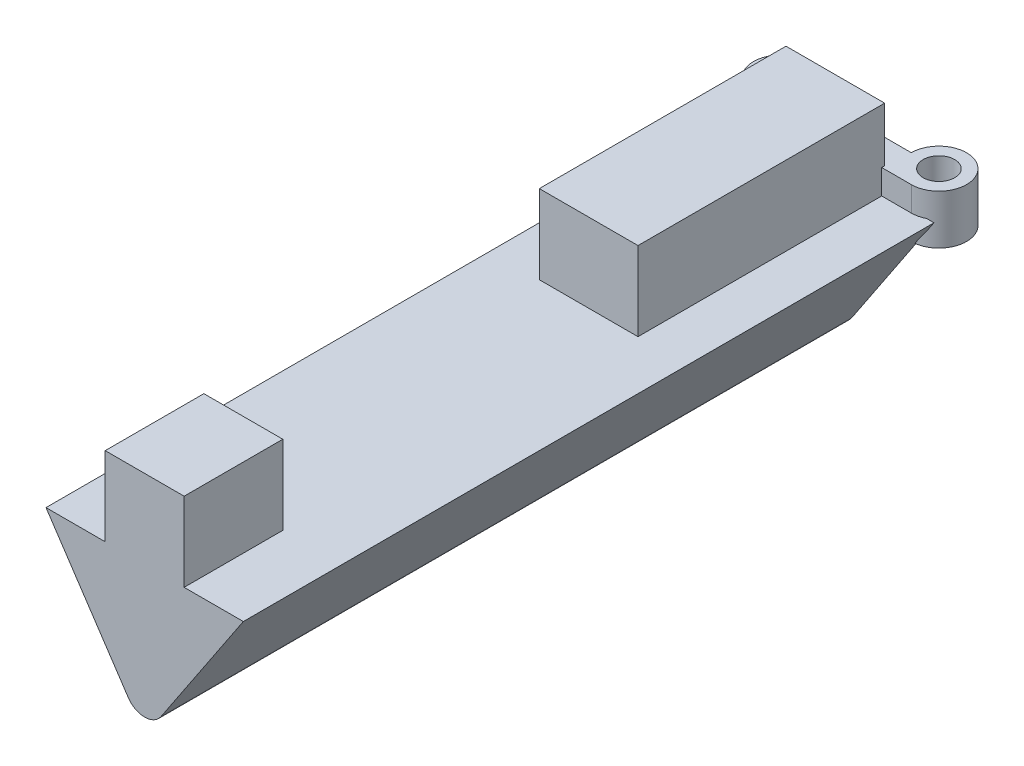
ISO-10303-21;
HEADER;
FILE_DESCRIPTION(('STEP AP214'),'2;1');
FILE_NAME('part.step','',(''),(''),'','','');
FILE_SCHEMA(('AUTOMOTIVE_DESIGN { 1 0 10303 214 1 1 1 1 }'));
ENDSEC;
DATA;
#1=APPLICATION_CONTEXT('core data for automotive mechanical design processes');
#2=APPLICATION_PROTOCOL_DEFINITION('international standard','automotive_design',2000,#1);
#3=PRODUCT_CONTEXT('',#1,'mechanical');
#4=PRODUCT('Part','Part','',(#3));
#5=PRODUCT_RELATED_PRODUCT_CATEGORY('part','',(#4));
#6=PRODUCT_DEFINITION_FORMATION('','',#4);
#7=PRODUCT_DEFINITION_CONTEXT('part definition',#1,'design');
#8=PRODUCT_DEFINITION('design','',#6,#7);
#9=PRODUCT_DEFINITION_SHAPE('','',#8);
#10=(LENGTH_UNIT() NAMED_UNIT(*) SI_UNIT(.MILLI.,.METRE.));
#11=(NAMED_UNIT(*) PLANE_ANGLE_UNIT() SI_UNIT($,.RADIAN.));
#12=(NAMED_UNIT(*) SI_UNIT($,.STERADIAN.) SOLID_ANGLE_UNIT());
#13=UNCERTAINTY_MEASURE_WITH_UNIT(LENGTH_MEASURE(1.E-05),#10,'distance_accuracy_value','');
#14=(GEOMETRIC_REPRESENTATION_CONTEXT(3) GLOBAL_UNCERTAINTY_ASSIGNED_CONTEXT((#13)) GLOBAL_UNIT_ASSIGNED_CONTEXT((#10,
#11,#12)) REPRESENTATION_CONTEXT('',''));
#15=CARTESIAN_POINT('',(0.,0.,0.));
#16=DIRECTION('',(0.,0.,1.));
#17=DIRECTION('',(1.,0.,0.));
#18=AXIS2_PLACEMENT_3D('',#15,#16,#17);
#19=CARTESIAN_POINT('',(0.,0.,0.));
#20=DIRECTION('',(0.,0.,1.));
#21=DIRECTION('',(1.,0.,0.));
#22=AXIS2_PLACEMENT_3D('',#19,#20,#21);
#23=PLANE('',#22);
#24=DIRECTION('',(-1.,0.,0.));
#25=VECTOR('',#24,1.);
#26=CARTESIAN_POINT('',(10.,0.,0.));
#27=LINE('',#26,#25);
#28=CARTESIAN_POINT('',(-9.26095202129187,0.,0.));
#29=VERTEX_POINT('',#28);
#30=CARTESIAN_POINT('',(-10.,0.,0.));
#31=VERTEX_POINT('',#30);
#32=EDGE_CURVE('E330',#29,#31,#27,.T.);
#33=ORIENTED_EDGE('',*,*,#32,.F.);
#34=DIRECTION('',(0.,-1.,0.));
#35=VECTOR('',#34,1.);
#36=CARTESIAN_POINT('',(-9.26095202129187,2.5,0.));
#37=LINE('',#36,#35);
#38=CARTESIAN_POINT('',(-9.26095202129187,-1.10857196806219,0.));
#39=VERTEX_POINT('',#38);
#40=EDGE_CURVE('E348',#29,#39,#37,.T.);
#41=ORIENTED_EDGE('',*,*,#40,.T.);
#42=DIRECTION('',(0.554700196225229,-0.832050294337844,0.));
#43=VECTOR('',#42,1.);
#44=CARTESIAN_POINT('',(-10.,0.,0.));
#45=LINE('',#44,#43);
#46=EDGE_CURVE('E324',#31,#39,#45,.T.);
#47=ORIENTED_EDGE('',*,*,#46,.F.);
#48=EDGE_LOOP('',(#33,#41,#47));
#49=FACE_BOUND('',#48,.T.);
#50=ADVANCED_FACE('F35',(#49),#23,.F.);
#51=DIRECTION('',(1.,0.,0.));
#52=VECTOR('',#51,1.);
#53=CARTESIAN_POINT('',(0.,2.5,0.));
#54=LINE('',#53,#52);
#55=CARTESIAN_POINT('',(-5.,2.5,0.));
#56=VERTEX_POINT('',#55);
#57=CARTESIAN_POINT('',(5.,2.5,0.));
#58=VERTEX_POINT('',#57);
#59=EDGE_CURVE('E229',#56,#58,#54,.T.);
#60=ORIENTED_EDGE('',*,*,#59,.F.);
#61=DIRECTION('',(0.,-1.,0.));
#62=VECTOR('',#61,1.);
#63=CARTESIAN_POINT('',(-5.,0.,0.));
#64=LINE('',#63,#62);
#65=CARTESIAN_POINT('',(-5.,8.,0.));
#66=VERTEX_POINT('',#65);
#67=EDGE_CURVE('E279',#66,#56,#64,.T.);
#68=ORIENTED_EDGE('',*,*,#67,.F.);
#69=DIRECTION('',(-1.,0.,0.));
#70=VECTOR('',#69,1.);
#71=CARTESIAN_POINT('',(5.,8.,0.));
#72=LINE('',#71,#70);
#73=CARTESIAN_POINT('',(5.,8.,0.));
#74=VERTEX_POINT('',#73);
#75=EDGE_CURVE('E290',#74,#66,#72,.T.);
#76=ORIENTED_EDGE('',*,*,#75,.F.);
#77=DIRECTION('',(0.,1.,0.));
#78=VECTOR('',#77,1.);
#79=CARTESIAN_POINT('',(5.,0.,0.));
#80=LINE('',#79,#78);
#81=EDGE_CURVE('E299',#58,#74,#80,.T.);
#82=ORIENTED_EDGE('',*,*,#81,.F.);
#83=EDGE_LOOP('',(#60,#68,#76,#82));
#84=FACE_BOUND('',#83,.T.);
#85=ADVANCED_FACE('F392',(#84),#23,.F.);
#86=DIRECTION('',(0.554700196225229,0.832050294337844,0.));
#87=VECTOR('',#86,1.);
#88=CARTESIAN_POINT('',(0.,-15.,0.));
#89=LINE('',#88,#87);
#90=CARTESIAN_POINT('',(9.26095202129186,-1.10857196806222,0.));
#91=VERTEX_POINT('',#90);
#92=CARTESIAN_POINT('',(10.,0.,0.));
#93=VERTEX_POINT('',#92);
#94=EDGE_CURVE('E327',#91,#93,#89,.T.);
#95=ORIENTED_EDGE('',*,*,#94,.F.);
#96=DIRECTION('',(0.,-1.,0.));
#97=VECTOR('',#96,1.);
#98=CARTESIAN_POINT('',(9.26095202129186,2.5,0.));
#99=LINE('',#98,#97);
#100=CARTESIAN_POINT('',(9.26095202129186,0.,0.));
#101=VERTEX_POINT('',#100);
#102=EDGE_CURVE('E346',#91,#101,#99,.F.);
#103=ORIENTED_EDGE('',*,*,#102,.T.);
#104=EDGE_CURVE('E317',#93,#101,#27,.T.);
#105=ORIENTED_EDGE('',*,*,#104,.F.);
#106=EDGE_LOOP('',(#95,#103,#105));
#107=FACE_BOUND('',#106,.T.);
#108=ADVANCED_FACE('F375',(#107),#23,.F.);
#109=CARTESIAN_POINT('',(10.,0.,70.));
#110=DIRECTION('',(0.,-1.,0.));
#111=DIRECTION('',(1.,0.,0.));
#112=AXIS2_PLACEMENT_3D('',#109,#110,#111);
#113=PLANE('',#112);
#114=DIRECTION('',(-1.,0.,0.));
#115=VECTOR('',#114,1.);
#116=CARTESIAN_POINT('',(10.,0.,0.300000000000009));
#117=LINE('',#116,#115);
#118=CARTESIAN_POINT('',(-5.,0.,0.300000000000012));
#119=VERTEX_POINT('',#118);
#120=CARTESIAN_POINT('',(-8.,0.,0.300000000000009));
#121=VERTEX_POINT('',#120);
#122=EDGE_CURVE('E242',#119,#121,#117,.T.);
#123=ORIENTED_EDGE('',*,*,#122,.T.);
#124=CARTESIAN_POINT('',(-8.,0.,-2.49999999999999));
#125=DIRECTION('',(0.,-1.,0.));
#126=DIRECTION('',(1.,0.,0.));
#127=AXIS2_PLACEMENT_3D('',#124,#125,#126);
#128=CIRCLE('',#127,2.8);
#129=EDGE_CURVE('E254',#121,#29,#128,.T.);
#130=ORIENTED_EDGE('',*,*,#129,.T.);
#131=ORIENTED_EDGE('',*,*,#32,.T.);
#132=DIRECTION('',(0.,0.,-1.));
#133=VECTOR('',#132,1.);
#134=CARTESIAN_POINT('',(-10.,0.,70.));
#135=LINE('',#134,#133);
#136=CARTESIAN_POINT('',(-10.,0.,70.));
#137=VERTEX_POINT('',#136);
#138=EDGE_CURVE('E323',#137,#31,#135,.T.);
#139=ORIENTED_EDGE('',*,*,#138,.F.);
#140=DIRECTION('',(-1.,0.,0.));
#141=VECTOR('',#140,1.);
#142=CARTESIAN_POINT('',(10.,0.,70.));
#143=LINE('',#142,#141);
#144=CARTESIAN_POINT('',(-4.,0.,70.));
#145=VERTEX_POINT('',#144);
#146=EDGE_CURVE('E319',#145,#137,#143,.T.);
#147=ORIENTED_EDGE('',*,*,#146,.F.);
#148=DIRECTION('',(0.,0.,1.));
#149=VECTOR('',#148,1.);
#150=CARTESIAN_POINT('',(-4.,0.,60.));
#151=LINE('',#150,#149);
#152=CARTESIAN_POINT('',(-4.,0.,60.));
#153=VERTEX_POINT('',#152);
#154=EDGE_CURVE('E270',#153,#145,#151,.T.);
#155=ORIENTED_EDGE('',*,*,#154,.F.);
#156=DIRECTION('',(1.,0.,0.));
#157=VECTOR('',#156,1.);
#158=CARTESIAN_POINT('',(4.,0.,60.));
#159=LINE('',#158,#157);
#160=CARTESIAN_POINT('',(4.,0.,60.));
#161=VERTEX_POINT('',#160);
#162=EDGE_CURVE('E260',#153,#161,#159,.T.);
#163=ORIENTED_EDGE('',*,*,#162,.T.);
#164=DIRECTION('',(0.,0.,1.));
#165=VECTOR('',#164,1.);
#166=CARTESIAN_POINT('',(4.,0.,60.));
#167=LINE('',#166,#165);
#168=CARTESIAN_POINT('',(4.,0.,70.));
#169=VERTEX_POINT('',#168);
#170=EDGE_CURVE('E282',#161,#169,#167,.T.);
#171=ORIENTED_EDGE('',*,*,#170,.T.);
#172=CARTESIAN_POINT('',(10.,0.,70.));
#173=VERTEX_POINT('',#172);
#174=EDGE_CURVE('E320',#173,#169,#143,.T.);
#175=ORIENTED_EDGE('',*,*,#174,.F.);
#176=DIRECTION('',(0.,0.,-1.));
#177=VECTOR('',#176,1.);
#178=CARTESIAN_POINT('',(10.,0.,70.));
#179=LINE('',#178,#177);
#180=EDGE_CURVE('E335',#173,#93,#179,.T.);
#181=ORIENTED_EDGE('',*,*,#180,.T.);
#182=ORIENTED_EDGE('',*,*,#104,.T.);
#183=CARTESIAN_POINT('',(7.99999999999998,0.,-2.49999999999999));
#184=DIRECTION('',(0.,-1.,0.));
#185=DIRECTION('',(1.,0.,0.));
#186=AXIS2_PLACEMENT_3D('',#183,#184,#185);
#187=CIRCLE('',#186,2.8);
#188=CARTESIAN_POINT('',(7.99999999999998,0.,0.300000000000011));
#189=VERTEX_POINT('',#188);
#190=EDGE_CURVE('E250',#101,#189,#187,.T.);
#191=ORIENTED_EDGE('',*,*,#190,.T.);
#192=CARTESIAN_POINT('',(5.,0.,0.300000000000012));
#193=VERTEX_POINT('',#192);
#194=EDGE_CURVE('E239',#189,#193,#117,.T.);
#195=ORIENTED_EDGE('',*,*,#194,.T.);
#196=DIRECTION('',(0.,0.,-1.));
#197=VECTOR('',#196,1.);
#198=CARTESIAN_POINT('',(5.,0.,25.));
#199=LINE('',#198,#197);
#200=CARTESIAN_POINT('',(5.,0.,25.));
#201=VERTEX_POINT('',#200);
#202=EDGE_CURVE('E307',#201,#193,#199,.T.);
#203=ORIENTED_EDGE('',*,*,#202,.F.);
#204=DIRECTION('',(1.,0.,0.));
#205=VECTOR('',#204,1.);
#206=CARTESIAN_POINT('',(5.,0.,25.));
#207=LINE('',#206,#205);
#208=CARTESIAN_POINT('',(-5.,0.,25.));
#209=VERTEX_POINT('',#208);
#210=EDGE_CURVE('E289',#209,#201,#207,.T.);
#211=ORIENTED_EDGE('',*,*,#210,.F.);
#212=DIRECTION('',(0.,0.,-1.));
#213=VECTOR('',#212,1.);
#214=CARTESIAN_POINT('',(-5.,0.,25.));
#215=LINE('',#214,#213);
#216=EDGE_CURVE('E310',#209,#119,#215,.T.);
#217=ORIENTED_EDGE('',*,*,#216,.T.);
#218=EDGE_LOOP('',(#123,#130,#131,#139,#147,#155,#163,#171,#175,#181,#182,#191,#195,#203,#211,#217));
#219=FACE_BOUND('',#218,.T.);
#220=ADVANCED_FACE('F377',(#219),#113,.F.);
#221=CARTESIAN_POINT('',(-10.,0.,70.));
#222=DIRECTION('',(0.832050294337844,0.554700196225229,0.));
#223=DIRECTION('',(-0.554700196225229,0.832050294337844,0.));
#224=AXIS2_PLACEMENT_3D('',#221,#222,#223);
#225=PLANE('',#224);
#226=CARTESIAN_POINT('',(-8.33333333333333,-2.5,0.));
#227=VERTEX_POINT('',#226);
#228=CARTESIAN_POINT('',(-1.66410058867569,-12.5038491169865,0.));
#229=VERTEX_POINT('',#228);
#230=EDGE_CURVE('E313',#227,#229,#45,.T.);
#231=ORIENTED_EDGE('',*,*,#230,.T.);
#232=DIRECTION('',(0.,0.,-1.));
#233=VECTOR('',#232,1.);
#234=CARTESIAN_POINT('',(-1.66410058867569,-12.5038491169865,70.));
#235=LINE('',#234,#233);
#236=CARTESIAN_POINT('',(-1.66410058867569,-12.5038491169865,70.));
#237=VERTEX_POINT('',#236);
#238=EDGE_CURVE('E43',#229,#237,#235,.F.);
#239=ORIENTED_EDGE('',*,*,#238,.T.);
#240=DIRECTION('',(0.554700196225229,-0.832050294337844,0.));
#241=VECTOR('',#240,1.);
#242=CARTESIAN_POINT('',(-10.,0.,70.));
#243=LINE('',#242,#241);
#244=EDGE_CURVE('E314',#137,#237,#243,.T.);
#245=ORIENTED_EDGE('',*,*,#244,.F.);
#246=ORIENTED_EDGE('',*,*,#138,.T.);
#247=ORIENTED_EDGE('',*,*,#46,.T.);
#248=CARTESIAN_POINT('',(-8.,-3.,-2.49999999999999));
#249=DIRECTION('',(0.832050294337844,0.554700196225229,0.));
#250=DIRECTION('',(0.554700196225229,-0.832050294337844,0.));
#251=AXIS2_PLACEMENT_3D('',#248,#249,#250);
#252=ELLIPSE('',#251,5.04777178564958,2.8);
#253=CARTESIAN_POINT('',(-8.33333333333333,-2.5,0.28008792826575));
#254=VERTEX_POINT('',#253);
#255=EDGE_CURVE('E252',#39,#254,#252,.T.);
#256=ORIENTED_EDGE('',*,*,#255,.T.);
#257=DIRECTION('',(0.,0.,-1.));
#258=VECTOR('',#257,1.);
#259=CARTESIAN_POINT('',(-8.33333333333333,-2.5,70.));
#260=LINE('',#259,#258);
#261=EDGE_CURVE('E246',#254,#227,#260,.T.);
#262=ORIENTED_EDGE('',*,*,#261,.T.);
#263=EDGE_LOOP('',(#231,#239,#245,#246,#247,#256,#262));
#264=FACE_BOUND('',#263,.T.);
#265=ADVANCED_FACE('F415',(#264),#225,.F.);
#266=CARTESIAN_POINT('',(0.,-15.,70.));
#267=DIRECTION('',(-0.832050294337843,0.554700196225229,0.));
#268=DIRECTION('',(-0.554700196225229,-0.832050294337844,0.));
#269=AXIS2_PLACEMENT_3D('',#266,#267,#268);
#270=PLANE('',#269);
#271=DIRECTION('',(0.554700196225229,0.832050294337844,0.));
#272=VECTOR('',#271,1.);
#273=CARTESIAN_POINT('',(0.,-15.,70.));
#274=LINE('',#273,#272);
#275=CARTESIAN_POINT('',(1.66410058867569,-12.5038491169865,70.));
#276=VERTEX_POINT('',#275);
#277=EDGE_CURVE('E316',#276,#173,#274,.T.);
#278=ORIENTED_EDGE('',*,*,#277,.F.);
#279=DIRECTION('',(0.,0.,-1.));
#280=VECTOR('',#279,1.);
#281=CARTESIAN_POINT('',(1.66410058867569,-12.5038491169865,70.));
#282=LINE('',#281,#280);
#283=CARTESIAN_POINT('',(1.66410058867569,-12.5038491169865,0.));
#284=VERTEX_POINT('',#283);
#285=EDGE_CURVE('E350',#276,#284,#282,.T.);
#286=ORIENTED_EDGE('',*,*,#285,.T.);
#287=CARTESIAN_POINT('',(8.33333333333334,-2.5,0.));
#288=VERTEX_POINT('',#287);
#289=EDGE_CURVE('E328',#284,#288,#89,.T.);
#290=ORIENTED_EDGE('',*,*,#289,.T.);
#291=DIRECTION('',(0.,0.,1.));
#292=VECTOR('',#291,1.);
#293=CARTESIAN_POINT('',(8.33333333333334,-2.5,70.));
#294=LINE('',#293,#292);
#295=CARTESIAN_POINT('',(8.33333333333334,-2.5,0.280087928265747));
#296=VERTEX_POINT('',#295);
#297=EDGE_CURVE('E244',#288,#296,#294,.T.);
#298=ORIENTED_EDGE('',*,*,#297,.T.);
#299=CARTESIAN_POINT('',(7.99999999999998,-3.00000000000003,-2.49999999999999));
#300=DIRECTION('',(-0.832050294337843,0.554700196225229,0.));
#301=DIRECTION('',(-0.554700196225229,-0.832050294337844,0.));
#302=AXIS2_PLACEMENT_3D('',#299,#300,#301);
#303=ELLIPSE('',#302,5.04777178564958,2.8);
#304=EDGE_CURVE('E248',#296,#91,#303,.T.);
#305=ORIENTED_EDGE('',*,*,#304,.T.);
#306=ORIENTED_EDGE('',*,*,#94,.T.);
#307=ORIENTED_EDGE('',*,*,#180,.F.);
#308=EDGE_LOOP('',(#278,#286,#290,#298,#305,#306,#307));
#309=FACE_BOUND('',#308,.T.);
#310=ADVANCED_FACE('F356',(#309),#270,.F.);
#311=CARTESIAN_POINT('',(0.,0.,70.));
#312=DIRECTION('',(0.,0.,1.));
#313=DIRECTION('',(1.,0.,0.));
#314=AXIS2_PLACEMENT_3D('',#311,#312,#313);
#315=PLANE('',#314);
#316=ORIENTED_EDGE('',*,*,#244,.T.);
#317=CARTESIAN_POINT('',(0.,-11.394448724536,70.));
#318=DIRECTION('',(0.,0.,1.));
#319=DIRECTION('',(1.,0.,0.));
#320=AXIS2_PLACEMENT_3D('',#317,#318,#319);
#321=CIRCLE('',#320,2.);
#322=EDGE_CURVE('E11',#237,#276,#321,.T.);
#323=ORIENTED_EDGE('',*,*,#322,.T.);
#324=ORIENTED_EDGE('',*,*,#277,.T.);
#325=ORIENTED_EDGE('',*,*,#174,.T.);
#326=DIRECTION('',(0.,1.,0.));
#327=VECTOR('',#326,1.);
#328=CARTESIAN_POINT('',(4.,0.,70.));
#329=LINE('',#328,#327);
#330=CARTESIAN_POINT('',(4.,8.,70.));
#331=VERTEX_POINT('',#330);
#332=EDGE_CURVE('E272',#169,#331,#329,.T.);
#333=ORIENTED_EDGE('',*,*,#332,.T.);
#334=DIRECTION('',(-1.,0.,0.));
#335=VECTOR('',#334,1.);
#336=CARTESIAN_POINT('',(4.,8.,70.));
#337=LINE('',#336,#335);
#338=CARTESIAN_POINT('',(-4.,8.,70.));
#339=VERTEX_POINT('',#338);
#340=EDGE_CURVE('E261',#331,#339,#337,.T.);
#341=ORIENTED_EDGE('',*,*,#340,.T.);
#342=DIRECTION('',(0.,-1.,0.));
#343=VECTOR('',#342,1.);
#344=CARTESIAN_POINT('',(-4.,0.,70.));
#345=LINE('',#344,#343);
#346=EDGE_CURVE('E256',#339,#145,#345,.T.);
#347=ORIENTED_EDGE('',*,*,#346,.T.);
#348=ORIENTED_EDGE('',*,*,#146,.T.);
#349=EDGE_LOOP('',(#316,#323,#324,#325,#333,#341,#347,#348));
#350=FACE_BOUND('',#349,.T.);
#351=ADVANCED_FACE('F381',(#350),#315,.T.);
#352=ORIENTED_EDGE('',*,*,#289,.F.);
#353=CARTESIAN_POINT('',(0.,-11.394448724536,0.));
#354=DIRECTION('',(0.,0.,1.));
#355=DIRECTION('',(1.,0.,0.));
#356=AXIS2_PLACEMENT_3D('',#353,#354,#355);
#357=CIRCLE('',#356,2.);
#358=EDGE_CURVE('E57',#284,#229,#357,.F.);
#359=ORIENTED_EDGE('',*,*,#358,.T.);
#360=ORIENTED_EDGE('',*,*,#230,.F.);
#361=DIRECTION('',(1.,0.,0.));
#362=VECTOR('',#361,1.);
#363=CARTESIAN_POINT('',(0.,-2.5,0.));
#364=LINE('',#363,#362);
#365=EDGE_CURVE('E343',#227,#288,#364,.T.);
#366=ORIENTED_EDGE('',*,*,#365,.T.);
#367=EDGE_LOOP('',(#352,#359,#360,#366));
#368=FACE_BOUND('',#367,.T.);
#369=ADVANCED_FACE('F360',(#368),#23,.F.);
#370=CARTESIAN_POINT('',(-5.,0.,25.));
#371=DIRECTION('',(1.,0.,0.));
#372=DIRECTION('',(0.,0.,-1.));
#373=AXIS2_PLACEMENT_3D('',#370,#371,#372);
#374=PLANE('',#373);
#375=DIRECTION('',(0.,0.,-1.));
#376=VECTOR('',#375,1.);
#377=CARTESIAN_POINT('',(-5.,2.5,25.));
#378=LINE('',#377,#376);
#379=CARTESIAN_POINT('',(-5.,2.5,0.300000000000009));
#380=VERTEX_POINT('',#379);
#381=EDGE_CURVE('E236',#380,#56,#378,.T.);
#382=ORIENTED_EDGE('',*,*,#381,.F.);
#383=DIRECTION('',(0.,-1.,0.));
#384=VECTOR('',#383,1.);
#385=CARTESIAN_POINT('',(-5.,0.,0.300000000000012));
#386=LINE('',#385,#384);
#387=EDGE_CURVE('E241',#380,#119,#386,.T.);
#388=ORIENTED_EDGE('',*,*,#387,.T.);
#389=ORIENTED_EDGE('',*,*,#216,.F.);
#390=DIRECTION('',(0.,-1.,0.));
#391=VECTOR('',#390,1.);
#392=CARTESIAN_POINT('',(-5.,0.,25.));
#393=LINE('',#392,#391);
#394=CARTESIAN_POINT('',(-5.,8.,25.));
#395=VERTEX_POINT('',#394);
#396=EDGE_CURVE('E287',#395,#209,#393,.T.);
#397=ORIENTED_EDGE('',*,*,#396,.F.);
#398=DIRECTION('',(0.,0.,-1.));
#399=VECTOR('',#398,1.);
#400=CARTESIAN_POINT('',(-5.,8.,25.));
#401=LINE('',#400,#399);
#402=EDGE_CURVE('E296',#395,#66,#401,.T.);
#403=ORIENTED_EDGE('',*,*,#402,.T.);
#404=ORIENTED_EDGE('',*,*,#67,.T.);
#405=EDGE_LOOP('',(#382,#388,#389,#397,#403,#404));
#406=FACE_BOUND('',#405,.T.);
#407=ADVANCED_FACE('F403',(#406),#374,.F.);
#408=CARTESIAN_POINT('',(5.,0.,25.));
#409=DIRECTION('',(-1.,0.,0.));
#410=DIRECTION('',(0.,0.,1.));
#411=AXIS2_PLACEMENT_3D('',#408,#409,#410);
#412=PLANE('',#411);
#413=ORIENTED_EDGE('',*,*,#202,.T.);
#414=DIRECTION('',(0.,1.,0.));
#415=VECTOR('',#414,1.);
#416=CARTESIAN_POINT('',(5.,0.,0.300000000000012));
#417=LINE('',#416,#415);
#418=CARTESIAN_POINT('',(5.,2.5,0.300000000000011));
#419=VERTEX_POINT('',#418);
#420=EDGE_CURVE('E341',#193,#419,#417,.T.);
#421=ORIENTED_EDGE('',*,*,#420,.T.);
#422=DIRECTION('',(0.,0.,1.));
#423=VECTOR('',#422,1.);
#424=CARTESIAN_POINT('',(5.,2.5,25.));
#425=LINE('',#424,#423);
#426=EDGE_CURVE('E338',#58,#419,#425,.T.);
#427=ORIENTED_EDGE('',*,*,#426,.F.);
#428=ORIENTED_EDGE('',*,*,#81,.T.);
#429=DIRECTION('',(0.,0.,-1.));
#430=VECTOR('',#429,1.);
#431=CARTESIAN_POINT('',(5.,8.,25.));
#432=LINE('',#431,#430);
#433=CARTESIAN_POINT('',(5.,8.,25.));
#434=VERTEX_POINT('',#433);
#435=EDGE_CURVE('E304',#434,#74,#432,.T.);
#436=ORIENTED_EDGE('',*,*,#435,.F.);
#437=DIRECTION('',(0.,1.,0.));
#438=VECTOR('',#437,1.);
#439=CARTESIAN_POINT('',(5.,0.,25.));
#440=LINE('',#439,#438);
#441=EDGE_CURVE('E292',#201,#434,#440,.T.);
#442=ORIENTED_EDGE('',*,*,#441,.F.);
#443=EDGE_LOOP('',(#413,#421,#427,#428,#436,#442));
#444=FACE_BOUND('',#443,.T.);
#445=ADVANCED_FACE('F408',(#444),#412,.F.);
#446=CARTESIAN_POINT('',(5.,8.,25.));
#447=DIRECTION('',(0.,-1.,0.));
#448=DIRECTION('',(0.,0.,-1.));
#449=AXIS2_PLACEMENT_3D('',#446,#447,#448);
#450=PLANE('',#449);
#451=ORIENTED_EDGE('',*,*,#75,.T.);
#452=ORIENTED_EDGE('',*,*,#402,.F.);
#453=DIRECTION('',(-1.,0.,0.));
#454=VECTOR('',#453,1.);
#455=CARTESIAN_POINT('',(5.,8.,25.));
#456=LINE('',#455,#454);
#457=EDGE_CURVE('E294',#434,#395,#456,.T.);
#458=ORIENTED_EDGE('',*,*,#457,.F.);
#459=ORIENTED_EDGE('',*,*,#435,.T.);
#460=EDGE_LOOP('',(#451,#452,#458,#459));
#461=FACE_BOUND('',#460,.T.);
#462=ADVANCED_FACE('F532',(#461),#450,.F.);
#463=CARTESIAN_POINT('',(0.,0.,25.));
#464=DIRECTION('',(0.,0.,1.));
#465=DIRECTION('',(1.,0.,0.));
#466=AXIS2_PLACEMENT_3D('',#463,#464,#465);
#467=PLANE('',#466);
#468=ORIENTED_EDGE('',*,*,#396,.T.);
#469=ORIENTED_EDGE('',*,*,#210,.T.);
#470=ORIENTED_EDGE('',*,*,#441,.T.);
#471=ORIENTED_EDGE('',*,*,#457,.T.);
#472=EDGE_LOOP('',(#468,#469,#470,#471));
#473=FACE_BOUND('',#472,.T.);
#474=ADVANCED_FACE('F596',(#473),#467,.T.);
#475=CARTESIAN_POINT('',(-4.,0.,60.));
#476=DIRECTION('',(-1.,0.,0.));
#477=DIRECTION('',(0.,0.,1.));
#478=AXIS2_PLACEMENT_3D('',#475,#476,#477);
#479=PLANE('',#478);
#480=ORIENTED_EDGE('',*,*,#346,.F.);
#481=DIRECTION('',(0.,0.,1.));
#482=VECTOR('',#481,1.);
#483=CARTESIAN_POINT('',(-4.,8.,60.));
#484=LINE('',#483,#482);
#485=CARTESIAN_POINT('',(-4.,8.,60.));
#486=VERTEX_POINT('',#485);
#487=EDGE_CURVE('E277',#486,#339,#484,.T.);
#488=ORIENTED_EDGE('',*,*,#487,.F.);
#489=DIRECTION('',(0.,-1.,0.));
#490=VECTOR('',#489,1.);
#491=CARTESIAN_POINT('',(-4.,0.,60.));
#492=LINE('',#491,#490);
#493=EDGE_CURVE('E257',#486,#153,#492,.T.);
#494=ORIENTED_EDGE('',*,*,#493,.T.);
#495=ORIENTED_EDGE('',*,*,#154,.T.);
#496=EDGE_LOOP('',(#480,#488,#494,#495));
#497=FACE_BOUND('',#496,.T.);
#498=ADVANCED_FACE('F587',(#497),#479,.T.);
#499=CARTESIAN_POINT('',(4.,8.,60.));
#500=DIRECTION('',(0.,1.,0.));
#501=DIRECTION('',(0.,0.,1.));
#502=AXIS2_PLACEMENT_3D('',#499,#500,#501);
#503=PLANE('',#502);
#504=ORIENTED_EDGE('',*,*,#340,.F.);
#505=DIRECTION('',(0.,0.,1.));
#506=VECTOR('',#505,1.);
#507=CARTESIAN_POINT('',(4.,8.,60.));
#508=LINE('',#507,#506);
#509=CARTESIAN_POINT('',(4.,8.,60.));
#510=VERTEX_POINT('',#509);
#511=EDGE_CURVE('E280',#510,#331,#508,.T.);
#512=ORIENTED_EDGE('',*,*,#511,.F.);
#513=DIRECTION('',(-1.,0.,0.));
#514=VECTOR('',#513,1.);
#515=CARTESIAN_POINT('',(4.,8.,60.));
#516=LINE('',#515,#514);
#517=EDGE_CURVE('E267',#510,#486,#516,.T.);
#518=ORIENTED_EDGE('',*,*,#517,.T.);
#519=ORIENTED_EDGE('',*,*,#487,.T.);
#520=EDGE_LOOP('',(#504,#512,#518,#519));
#521=FACE_BOUND('',#520,.T.);
#522=ADVANCED_FACE('F577',(#521),#503,.T.);
#523=CARTESIAN_POINT('',(4.,0.,60.));
#524=DIRECTION('',(1.,0.,0.));
#525=DIRECTION('',(0.,0.,-1.));
#526=AXIS2_PLACEMENT_3D('',#523,#524,#525);
#527=PLANE('',#526);
#528=ORIENTED_EDGE('',*,*,#332,.F.);
#529=ORIENTED_EDGE('',*,*,#170,.F.);
#530=DIRECTION('',(0.,1.,0.));
#531=VECTOR('',#530,1.);
#532=CARTESIAN_POINT('',(4.,0.,60.));
#533=LINE('',#532,#531);
#534=EDGE_CURVE('E264',#161,#510,#533,.T.);
#535=ORIENTED_EDGE('',*,*,#534,.T.);
#536=ORIENTED_EDGE('',*,*,#511,.T.);
#537=EDGE_LOOP('',(#528,#529,#535,#536));
#538=FACE_BOUND('',#537,.T.);
#539=ADVANCED_FACE('F567',(#538),#527,.T.);
#540=CARTESIAN_POINT('',(0.,0.,60.));
#541=DIRECTION('',(0.,0.,1.));
#542=DIRECTION('',(1.,0.,0.));
#543=AXIS2_PLACEMENT_3D('',#540,#541,#542);
#544=PLANE('',#543);
#545=ORIENTED_EDGE('',*,*,#493,.F.);
#546=ORIENTED_EDGE('',*,*,#517,.F.);
#547=ORIENTED_EDGE('',*,*,#534,.F.);
#548=ORIENTED_EDGE('',*,*,#162,.F.);
#549=EDGE_LOOP('',(#545,#546,#547,#548));
#550=FACE_BOUND('',#549,.T.);
#551=ADVANCED_FACE('F521',(#550),#544,.F.);
#552=CARTESIAN_POINT('',(-8.,2.5,-2.49999999999999));
#553=DIRECTION('',(0.,-1.,0.));
#554=DIRECTION('',(1.,0.,0.));
#555=AXIS2_PLACEMENT_3D('',#552,#553,#554);
#556=CYLINDRICAL_SURFACE('',#555,2.8);
#557=ORIENTED_EDGE('',*,*,#129,.F.);
#558=DIRECTION('',(0.,-1.,0.));
#559=VECTOR('',#558,1.);
#560=CARTESIAN_POINT('',(-8.,2.5,0.300000000000011));
#561=LINE('',#560,#559);
#562=CARTESIAN_POINT('',(-8.,2.5,0.300000000000011));
#563=VERTEX_POINT('',#562);
#564=EDGE_CURVE('E211',#563,#121,#561,.T.);
#565=ORIENTED_EDGE('',*,*,#564,.F.);
#566=CARTESIAN_POINT('',(-8.,2.5,-2.49999999999999));
#567=DIRECTION('',(0.,-1.,0.));
#568=DIRECTION('',(1.,0.,0.));
#569=AXIS2_PLACEMENT_3D('',#566,#567,#568);
#570=CIRCLE('',#569,2.8);
#571=CARTESIAN_POINT('',(-5.2,2.5,-2.49999999999999));
#572=VERTEX_POINT('',#571);
#573=EDGE_CURVE('E202',#563,#572,#570,.T.);
#574=ORIENTED_EDGE('',*,*,#573,.T.);
#575=DIRECTION('',(0.,-1.,0.));
#576=VECTOR('',#575,1.);
#577=CARTESIAN_POINT('',(-5.2,2.5,-2.49999999999999));
#578=LINE('',#577,#576);
#579=CARTESIAN_POINT('',(-5.2,-2.5,-2.49999999999999));
#580=VERTEX_POINT('',#579);
#581=EDGE_CURVE('E185',#572,#580,#578,.T.);
#582=ORIENTED_EDGE('',*,*,#581,.T.);
#583=CARTESIAN_POINT('',(-8.,-2.5,-2.49999999999999));
#584=DIRECTION('',(0.,-1.,0.));
#585=DIRECTION('',(1.,0.,0.));
#586=AXIS2_PLACEMENT_3D('',#583,#584,#585);
#587=CIRCLE('',#586,2.8);
#588=EDGE_CURVE('E224',#254,#580,#587,.T.);
#589=ORIENTED_EDGE('',*,*,#588,.F.);
#590=ORIENTED_EDGE('',*,*,#255,.F.);
#591=ORIENTED_EDGE('',*,*,#40,.F.);
#592=EDGE_LOOP('',(#557,#565,#574,#582,#589,#590,#591));
#593=FACE_BOUND('',#592,.T.);
#594=ADVANCED_FACE('F209',(#593),#556,.T.);
#595=CARTESIAN_POINT('',(7.99999999999998,2.5,-2.49999999999999));
#596=DIRECTION('',(0.,-1.,0.));
#597=DIRECTION('',(1.,0.,0.));
#598=AXIS2_PLACEMENT_3D('',#595,#596,#597);
#599=CYLINDRICAL_SURFACE('',#598,2.8);
#600=ORIENTED_EDGE('',*,*,#190,.F.);
#601=ORIENTED_EDGE('',*,*,#102,.F.);
#602=ORIENTED_EDGE('',*,*,#304,.F.);
#603=CARTESIAN_POINT('',(7.99999999999998,-2.5,-2.49999999999999));
#604=DIRECTION('',(0.,-1.,0.));
#605=DIRECTION('',(-1.,0.,0.));
#606=AXIS2_PLACEMENT_3D('',#603,#604,#605);
#607=CIRCLE('',#606,2.8);
#608=CARTESIAN_POINT('',(5.19999999999998,-2.5,-2.49999999999999));
#609=VERTEX_POINT('',#608);
#610=EDGE_CURVE('E212',#609,#296,#607,.T.);
#611=ORIENTED_EDGE('',*,*,#610,.F.);
#612=DIRECTION('',(0.,-1.,0.));
#613=VECTOR('',#612,1.);
#614=CARTESIAN_POINT('',(5.19999999999998,2.5,-2.49999999999999));
#615=LINE('',#614,#613);
#616=CARTESIAN_POINT('',(5.19999999999998,2.5,-2.49999999999999));
#617=VERTEX_POINT('',#616);
#618=EDGE_CURVE('E194',#617,#609,#615,.T.);
#619=ORIENTED_EDGE('',*,*,#618,.F.);
#620=CARTESIAN_POINT('',(7.99999999999998,2.5,-2.49999999999999));
#621=DIRECTION('',(0.,-1.,0.));
#622=DIRECTION('',(-1.,0.,0.));
#623=AXIS2_PLACEMENT_3D('',#620,#621,#622);
#624=CIRCLE('',#623,2.8);
#625=CARTESIAN_POINT('',(7.99999999999998,2.5,0.300000000000011));
#626=VERTEX_POINT('',#625);
#627=EDGE_CURVE('E205',#617,#626,#624,.T.);
#628=ORIENTED_EDGE('',*,*,#627,.T.);
#629=DIRECTION('',(0.,-1.,0.));
#630=VECTOR('',#629,1.);
#631=CARTESIAN_POINT('',(7.99999999999998,2.5,0.300000000000011));
#632=LINE('',#631,#630);
#633=EDGE_CURVE('E230',#626,#189,#632,.T.);
#634=ORIENTED_EDGE('',*,*,#633,.T.);
#635=EDGE_LOOP('',(#600,#601,#602,#611,#619,#628,#634));
#636=FACE_BOUND('',#635,.T.);
#637=ADVANCED_FACE('F372',(#636),#599,.T.);
#638=CARTESIAN_POINT('',(-8.,-2.5,-2.49999999999999));
#639=DIRECTION('',(0.,-1.,0.));
#640=DIRECTION('',(1.,0.,0.));
#641=AXIS2_PLACEMENT_3D('',#638,#639,#640);
#642=PLANE('',#641);
#643=CARTESIAN_POINT('',(-8.,-2.5,-2.49999999999999));
#644=DIRECTION('',(0.,-1.,0.));
#645=DIRECTION('',(1.,0.,0.));
#646=AXIS2_PLACEMENT_3D('',#643,#644,#645);
#647=CIRCLE('',#646,1.6);
#648=CARTESIAN_POINT('',(-6.4,-2.5,-2.49999999999999));
#649=VERTEX_POINT('',#648);
#650=EDGE_CURVE('E217',#649,#649,#647,.T.);
#651=ORIENTED_EDGE('',*,*,#650,.F.);
#652=EDGE_LOOP('',(#651));
#653=FACE_BOUND('',#652,.T.);
#654=CARTESIAN_POINT('',(7.99999999999998,-2.5,-2.49999999999999));
#655=DIRECTION('',(0.,-1.,0.));
#656=DIRECTION('',(-1.,0.,0.));
#657=AXIS2_PLACEMENT_3D('',#654,#655,#656);
#658=CIRCLE('',#657,1.6);
#659=CARTESIAN_POINT('',(6.39999999999998,-2.5,-2.49999999999999));
#660=VERTEX_POINT('',#659);
#661=EDGE_CURVE('E663',#660,#660,#658,.T.);
#662=ORIENTED_EDGE('',*,*,#661,.F.);
#663=EDGE_LOOP('',(#662));
#664=FACE_BOUND('',#663,.T.);
#665=ORIENTED_EDGE('',*,*,#261,.F.);
#666=ORIENTED_EDGE('',*,*,#588,.T.);
#667=DIRECTION('',(1.,0.,0.));
#668=VECTOR('',#667,1.);
#669=CARTESIAN_POINT('',(-5.2,-2.5,-2.49999999999999));
#670=LINE('',#669,#668);
#671=EDGE_CURVE('E190',#580,#609,#670,.T.);
#672=ORIENTED_EDGE('',*,*,#671,.T.);
#673=ORIENTED_EDGE('',*,*,#610,.T.);
#674=ORIENTED_EDGE('',*,*,#297,.F.);
#675=ORIENTED_EDGE('',*,*,#365,.F.);
#676=EDGE_LOOP('',(#665,#666,#672,#673,#674,#675));
#677=FACE_BOUND('',#676,.T.);
#678=ADVANCED_FACE('F365',(#653,#664,#677),#642,.T.);
#679=CARTESIAN_POINT('',(-8.,2.5,0.300000000000011));
#680=DIRECTION('',(0.,0.,1.));
#681=DIRECTION('',(1.,0.,0.));
#682=AXIS2_PLACEMENT_3D('',#679,#680,#681);
#683=PLANE('',#682);
#684=ORIENTED_EDGE('',*,*,#122,.F.);
#685=ORIENTED_EDGE('',*,*,#387,.F.);
#686=DIRECTION('',(-1.,0.,0.));
#687=VECTOR('',#686,1.);
#688=CARTESIAN_POINT('',(-8.,2.5,0.300000000000011));
#689=LINE('',#688,#687);
#690=EDGE_CURVE('E221',#380,#563,#689,.T.);
#691=ORIENTED_EDGE('',*,*,#690,.T.);
#692=ORIENTED_EDGE('',*,*,#564,.T.);
#693=EDGE_LOOP('',(#684,#685,#691,#692));
#694=FACE_BOUND('',#693,.T.);
#695=ADVANCED_FACE('F485',(#694),#683,.T.);
#696=ORIENTED_EDGE('',*,*,#194,.F.);
#697=ORIENTED_EDGE('',*,*,#633,.F.);
#698=EDGE_CURVE('E195',#626,#419,#689,.T.);
#699=ORIENTED_EDGE('',*,*,#698,.T.);
#700=ORIENTED_EDGE('',*,*,#420,.F.);
#701=EDGE_LOOP('',(#696,#697,#699,#700));
#702=FACE_BOUND('',#701,.T.);
#703=ADVANCED_FACE('F473',(#702),#683,.T.);
#704=CARTESIAN_POINT('',(-8.,2.5,-2.49999999999999));
#705=DIRECTION('',(0.,-1.,0.));
#706=DIRECTION('',(1.,0.,0.));
#707=AXIS2_PLACEMENT_3D('',#704,#705,#706);
#708=PLANE('',#707);
#709=CARTESIAN_POINT('',(7.99999999999998,2.5,-2.49999999999999));
#710=DIRECTION('',(0.,-1.,0.));
#711=DIRECTION('',(-1.,0.,0.));
#712=AXIS2_PLACEMENT_3D('',#709,#710,#711);
#713=CIRCLE('',#712,1.6);
#714=CARTESIAN_POINT('',(6.39999999999998,2.5,-2.49999999999999));
#715=VERTEX_POINT('',#714);
#716=EDGE_CURVE('E665',#715,#715,#713,.T.);
#717=ORIENTED_EDGE('',*,*,#716,.T.);
#718=EDGE_LOOP('',(#717));
#719=FACE_BOUND('',#718,.T.);
#720=CARTESIAN_POINT('',(-8.,2.5,-2.49999999999999));
#721=DIRECTION('',(0.,-1.,0.));
#722=DIRECTION('',(1.,0.,0.));
#723=AXIS2_PLACEMENT_3D('',#720,#721,#722);
#724=CIRCLE('',#723,1.6);
#725=CARTESIAN_POINT('',(-6.4,2.5,-2.49999999999999));
#726=VERTEX_POINT('',#725);
#727=EDGE_CURVE('E226',#726,#726,#724,.T.);
#728=ORIENTED_EDGE('',*,*,#727,.T.);
#729=EDGE_LOOP('',(#728));
#730=FACE_BOUND('',#729,.T.);
#731=ORIENTED_EDGE('',*,*,#690,.F.);
#732=ORIENTED_EDGE('',*,*,#381,.T.);
#733=ORIENTED_EDGE('',*,*,#59,.T.);
#734=ORIENTED_EDGE('',*,*,#426,.T.);
#735=ORIENTED_EDGE('',*,*,#698,.F.);
#736=ORIENTED_EDGE('',*,*,#627,.F.);
#737=DIRECTION('',(1.,0.,0.));
#738=VECTOR('',#737,1.);
#739=CARTESIAN_POINT('',(-5.2,2.5,-2.49999999999999));
#740=LINE('',#739,#738);
#741=EDGE_CURVE('E188',#572,#617,#740,.T.);
#742=ORIENTED_EDGE('',*,*,#741,.F.);
#743=ORIENTED_EDGE('',*,*,#573,.F.);
#744=EDGE_LOOP('',(#731,#732,#733,#734,#735,#736,#742,#743));
#745=FACE_BOUND('',#744,.T.);
#746=ADVANCED_FACE('F201',(#719,#730,#745),#708,.F.);
#747=CARTESIAN_POINT('',(-5.2,2.5,-2.49999999999999));
#748=DIRECTION('',(0.,0.,-1.));
#749=DIRECTION('',(-1.,0.,0.));
#750=AXIS2_PLACEMENT_3D('',#747,#748,#749);
#751=PLANE('',#750);
#752=ORIENTED_EDGE('',*,*,#671,.F.);
#753=ORIENTED_EDGE('',*,*,#581,.F.);
#754=ORIENTED_EDGE('',*,*,#741,.T.);
#755=ORIENTED_EDGE('',*,*,#618,.T.);
#756=EDGE_LOOP('',(#752,#753,#754,#755));
#757=FACE_BOUND('',#756,.T.);
#758=ADVANCED_FACE('F187',(#757),#751,.T.);
#759=CARTESIAN_POINT('',(-8.,2.5,-2.49999999999999));
#760=DIRECTION('',(0.,-1.,0.));
#761=DIRECTION('',(1.,0.,0.));
#762=AXIS2_PLACEMENT_3D('',#759,#760,#761);
#763=CYLINDRICAL_SURFACE('',#762,1.6);
#764=ORIENTED_EDGE('',*,*,#727,.F.);
#765=EDGE_LOOP('',(#764));
#766=FACE_BOUND('',#765,.T.);
#767=ORIENTED_EDGE('',*,*,#650,.T.);
#768=EDGE_LOOP('',(#767));
#769=FACE_BOUND('',#768,.T.);
#770=ADVANCED_FACE('F388',(#766,#769),#763,.F.);
#771=CARTESIAN_POINT('',(7.99999999999998,2.5,-2.49999999999999));
#772=DIRECTION('',(0.,-1.,0.));
#773=DIRECTION('',(1.,0.,0.));
#774=AXIS2_PLACEMENT_3D('',#771,#772,#773);
#775=CYLINDRICAL_SURFACE('',#774,1.6);
#776=ORIENTED_EDGE('',*,*,#716,.F.);
#777=EDGE_LOOP('',(#776));
#778=FACE_BOUND('',#777,.T.);
#779=ORIENTED_EDGE('',*,*,#661,.T.);
#780=EDGE_LOOP('',(#779));
#781=FACE_BOUND('',#780,.T.);
#782=ADVANCED_FACE('F384',(#778,#781),#775,.F.);
#783=CARTESIAN_POINT('',(0.,-11.394448724536,70.));
#784=DIRECTION('',(0.,0.,-1.));
#785=DIRECTION('',(-1.,0.,0.));
#786=AXIS2_PLACEMENT_3D('',#783,#784,#785);
#787=CYLINDRICAL_SURFACE('',#786,2.);
#788=ORIENTED_EDGE('',*,*,#322,.F.);
#789=ORIENTED_EDGE('',*,*,#238,.F.);
#790=ORIENTED_EDGE('',*,*,#358,.F.);
#791=ORIENTED_EDGE('',*,*,#285,.F.);
#792=EDGE_LOOP('',(#788,#789,#790,#791));
#793=FACE_BOUND('',#792,.T.);
#794=ADVANCED_FACE('F37',(#793),#787,.T.);
#795=CLOSED_SHELL('',(#50,#85,#108,#220,#265,#310,#351,#369,#407,#445,#462,#474,#498,#522,#539,
#551,#594,#637,#678,#695,#703,#746,#758,#770,#782,#794));
#796=MANIFOLD_SOLID_BREP('B2',#795);
#797=ADVANCED_BREP_SHAPE_REPRESENTATION('',(#18,#796),#14);
#798=SHAPE_DEFINITION_REPRESENTATION(#9,#797);
ENDSEC;
END-ISO-10303-21;
